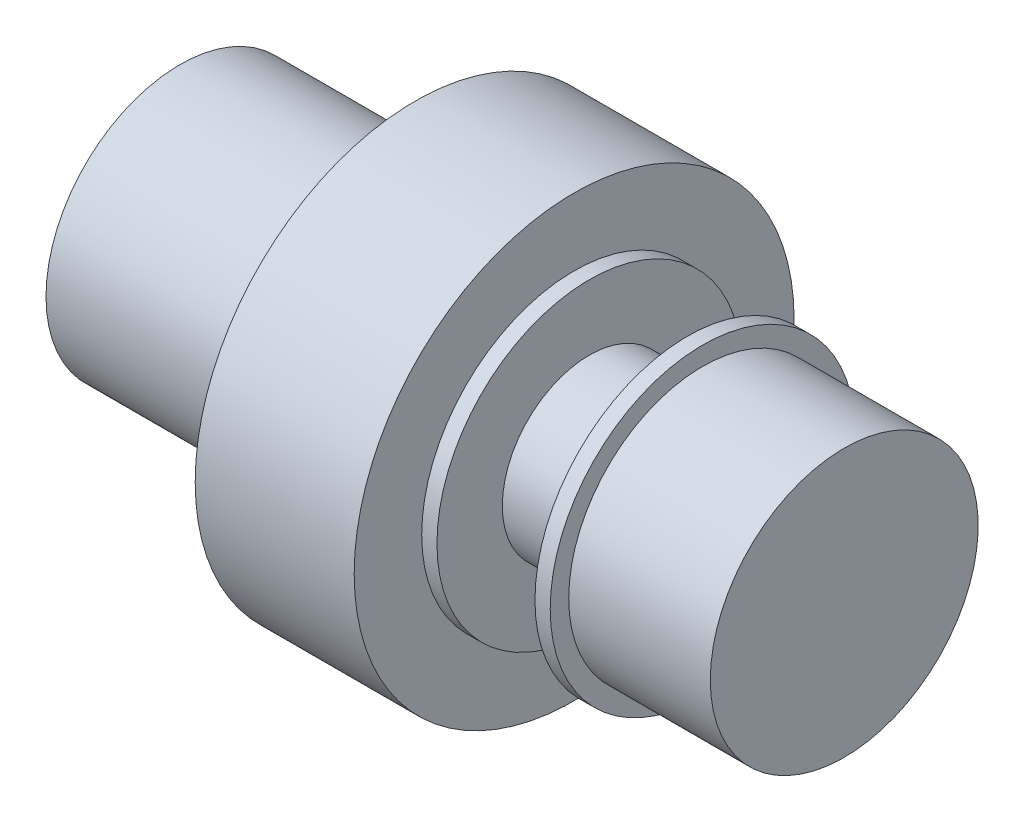
ISO-10303-21;
HEADER;
FILE_DESCRIPTION(('STEP AP214'),'2;1');
FILE_NAME('part.step','',(''),(''),'','','');
FILE_SCHEMA(('AUTOMOTIVE_DESIGN { 1 0 10303 214 1 1 1 1 }'));
ENDSEC;
DATA;
#1=APPLICATION_CONTEXT('core data for automotive mechanical design processes');
#2=APPLICATION_PROTOCOL_DEFINITION('international standard','automotive_design',2000,#1);
#3=PRODUCT_CONTEXT('',#1,'mechanical');
#4=PRODUCT('Part','Part','',(#3));
#5=PRODUCT_RELATED_PRODUCT_CATEGORY('part','',(#4));
#6=PRODUCT_DEFINITION_FORMATION('','',#4);
#7=PRODUCT_DEFINITION_CONTEXT('part definition',#1,'design');
#8=PRODUCT_DEFINITION('design','',#6,#7);
#9=PRODUCT_DEFINITION_SHAPE('','',#8);
#10=(LENGTH_UNIT() NAMED_UNIT(*) SI_UNIT(.MILLI.,.METRE.));
#11=(NAMED_UNIT(*) PLANE_ANGLE_UNIT() SI_UNIT($,.RADIAN.));
#12=(NAMED_UNIT(*) SI_UNIT($,.STERADIAN.) SOLID_ANGLE_UNIT());
#13=UNCERTAINTY_MEASURE_WITH_UNIT(LENGTH_MEASURE(1.E-05),#10,'distance_accuracy_value','');
#14=(GEOMETRIC_REPRESENTATION_CONTEXT(3) GLOBAL_UNCERTAINTY_ASSIGNED_CONTEXT((#13)) GLOBAL_UNIT_ASSIGNED_CONTEXT((#10,
#11,#12)) REPRESENTATION_CONTEXT('',''));
#15=CARTESIAN_POINT('',(0.,0.,0.));
#16=DIRECTION('',(0.,0.,1.));
#17=DIRECTION('',(1.,0.,0.));
#18=AXIS2_PLACEMENT_3D('',#15,#16,#17);
#19=CARTESIAN_POINT('',(28.5,101.,0.));
#20=DIRECTION('',(-1.,0.,0.));
#21=DIRECTION('',(0.,0.,1.));
#22=AXIS2_PLACEMENT_3D('',#19,#20,#21);
#23=PLANE('',#22);
#24=CARTESIAN_POINT('',(28.5,0.,0.));
#25=DIRECTION('',(-1.,0.,0.));
#26=DIRECTION('',(0.,0.,1.));
#27=AXIS2_PLACEMENT_3D('',#24,#25,#26);
#28=CIRCLE('',#27,101.);
#29=CARTESIAN_POINT('',(28.5,0.,101.));
#30=VERTEX_POINT('',#29);
#31=EDGE_CURVE('E11',#30,#30,#28,.T.);
#32=ORIENTED_EDGE('',*,*,#31,.F.);
#33=EDGE_LOOP('',(#32));
#34=FACE_BOUND('',#33,.T.);
#35=CARTESIAN_POINT('',(28.5,0.,0.));
#36=DIRECTION('',(-1.,0.,0.));
#37=DIRECTION('',(0.,0.,1.));
#38=AXIS2_PLACEMENT_3D('',#35,#36,#37);
#39=CIRCLE('',#38,70.);
#40=CARTESIAN_POINT('',(28.5,0.,70.));
#41=VERTEX_POINT('',#40);
#42=EDGE_CURVE('E97',#41,#41,#39,.T.);
#43=ORIENTED_EDGE('',*,*,#42,.T.);
#44=EDGE_LOOP('',(#43));
#45=FACE_BOUND('',#44,.T.);
#46=ADVANCED_FACE('F33',(#34,#45),#23,.F.);
#47=CARTESIAN_POINT('',(-1716.32432220827,0.,0.));
#48=DIRECTION('',(-1.,0.,0.));
#49=DIRECTION('',(0.,0.,1.));
#50=AXIS2_PLACEMENT_3D('',#47,#48,#49);
#51=CYLINDRICAL_SURFACE('',#50,101.);
#52=CARTESIAN_POINT('',(-44.5,0.,0.));
#53=DIRECTION('',(-1.,0.,0.));
#54=DIRECTION('',(0.,0.,1.));
#55=AXIS2_PLACEMENT_3D('',#52,#53,#54);
#56=CIRCLE('',#55,101.);
#57=CARTESIAN_POINT('',(-44.5,0.,101.));
#58=VERTEX_POINT('',#57);
#59=EDGE_CURVE('E40',#58,#58,#56,.T.);
#60=ORIENTED_EDGE('',*,*,#59,.F.);
#61=EDGE_LOOP('',(#60));
#62=FACE_BOUND('',#61,.T.);
#63=ORIENTED_EDGE('',*,*,#31,.T.);
#64=EDGE_LOOP('',(#63));
#65=FACE_BOUND('',#64,.T.);
#66=ADVANCED_FACE('F131',(#62,#65),#51,.T.);
#67=CARTESIAN_POINT('',(-44.5,61.5,0.));
#68=DIRECTION('',(1.,0.,0.));
#69=DIRECTION('',(0.,0.,-1.));
#70=AXIS2_PLACEMENT_3D('',#67,#68,#69);
#71=PLANE('',#70);
#72=CARTESIAN_POINT('',(-44.5,96.,0.));
#73=DIRECTION('',(-1.,0.,0.));
#74=DIRECTION('',(0.,0.,1.));
#75=AXIS2_PLACEMENT_3D('',#72,#73,#74);
#76=CIRCLE('',#75,2.775);
#77=CARTESIAN_POINT('',(-44.5,96.,2.77499999999999));
#78=VERTEX_POINT('',#77);
#79=EDGE_CURVE('E70',#78,#78,#76,.T.);
#80=ORIENTED_EDGE('',*,*,#79,.F.);
#81=EDGE_LOOP('',(#80));
#82=FACE_BOUND('',#81,.T.);
#83=CARTESIAN_POINT('',(-44.5,0.,96.));
#84=DIRECTION('',(-1.,0.,0.));
#85=DIRECTION('',(0.,0.,1.));
#86=AXIS2_PLACEMENT_3D('',#83,#84,#85);
#87=CIRCLE('',#86,2.775);
#88=CARTESIAN_POINT('',(-44.5,0.,98.775));
#89=VERTEX_POINT('',#88);
#90=EDGE_CURVE('E63',#89,#89,#87,.T.);
#91=ORIENTED_EDGE('',*,*,#90,.F.);
#92=EDGE_LOOP('',(#91));
#93=FACE_BOUND('',#92,.T.);
#94=CARTESIAN_POINT('',(-44.5,-96.,0.));
#95=DIRECTION('',(-1.,0.,0.));
#96=DIRECTION('',(0.,0.,1.));
#97=AXIS2_PLACEMENT_3D('',#94,#95,#96);
#98=CIRCLE('',#97,2.775);
#99=CARTESIAN_POINT('',(-44.5,-96.,2.775));
#100=VERTEX_POINT('',#99);
#101=EDGE_CURVE('E79',#100,#100,#98,.T.);
#102=ORIENTED_EDGE('',*,*,#101,.F.);
#103=EDGE_LOOP('',(#102));
#104=FACE_BOUND('',#103,.T.);
#105=CARTESIAN_POINT('',(-44.5,0.,-96.));
#106=DIRECTION('',(-1.,0.,0.));
#107=DIRECTION('',(0.,0.,1.));
#108=AXIS2_PLACEMENT_3D('',#105,#106,#107);
#109=CIRCLE('',#108,2.775);
#110=CARTESIAN_POINT('',(-44.5,0.,-93.225));
#111=VERTEX_POINT('',#110);
#112=EDGE_CURVE('E88',#111,#111,#109,.T.);
#113=ORIENTED_EDGE('',*,*,#112,.F.);
#114=EDGE_LOOP('',(#113));
#115=FACE_BOUND('',#114,.T.);
#116=CARTESIAN_POINT('',(-44.5,0.,0.));
#117=DIRECTION('',(-1.,0.,0.));
#118=DIRECTION('',(0.,0.,1.));
#119=AXIS2_PLACEMENT_3D('',#116,#117,#118);
#120=CIRCLE('',#119,61.5);
#121=CARTESIAN_POINT('',(-44.5,0.,61.5));
#122=VERTEX_POINT('',#121);
#123=EDGE_CURVE('E124',#122,#122,#120,.T.);
#124=ORIENTED_EDGE('',*,*,#123,.F.);
#125=EDGE_LOOP('',(#124));
#126=FACE_BOUND('',#125,.T.);
#127=ORIENTED_EDGE('',*,*,#59,.T.);
#128=EDGE_LOOP('',(#127));
#129=FACE_BOUND('',#128,.T.);
#130=ADVANCED_FACE('F129',(#82,#93,#104,#115,#126,#129),#71,.F.);
#131=CARTESIAN_POINT('',(-1716.32432220827,0.,0.));
#132=DIRECTION('',(-1.,0.,0.));
#133=DIRECTION('',(0.,0.,1.));
#134=AXIS2_PLACEMENT_3D('',#131,#132,#133);
#135=CYLINDRICAL_SURFACE('',#134,61.5);
#136=CARTESIAN_POINT('',(-152.5,0.,0.));
#137=DIRECTION('',(-1.,0.,0.));
#138=DIRECTION('',(0.,0.,1.));
#139=AXIS2_PLACEMENT_3D('',#136,#137,#138);
#140=CIRCLE('',#139,61.5);
#141=CARTESIAN_POINT('',(-152.5,0.,61.5));
#142=VERTEX_POINT('',#141);
#143=EDGE_CURVE('E121',#142,#142,#140,.T.);
#144=ORIENTED_EDGE('',*,*,#143,.F.);
#145=EDGE_LOOP('',(#144));
#146=FACE_BOUND('',#145,.T.);
#147=ORIENTED_EDGE('',*,*,#123,.T.);
#148=EDGE_LOOP('',(#147));
#149=FACE_BOUND('',#148,.T.);
#150=ADVANCED_FACE('F190',(#146,#149),#135,.T.);
#151=CARTESIAN_POINT('',(-152.5,0.,0.));
#152=DIRECTION('',(1.,0.,0.));
#153=DIRECTION('',(0.,0.,-1.));
#154=AXIS2_PLACEMENT_3D('',#151,#152,#153);
#155=PLANE('',#154);
#156=ORIENTED_EDGE('',*,*,#143,.T.);
#157=EDGE_LOOP('',(#156));
#158=FACE_BOUND('',#157,.T.);
#159=ADVANCED_FACE('F185',(#158),#155,.F.);
#160=CARTESIAN_POINT('',(152.5,0.,0.));
#161=DIRECTION('',(-1.,0.,0.));
#162=DIRECTION('',(0.,0.,1.));
#163=AXIS2_PLACEMENT_3D('',#160,#161,#162);
#164=PLANE('',#163);
#165=CARTESIAN_POINT('',(152.5,0.,0.));
#166=DIRECTION('',(-1.,0.,0.));
#167=DIRECTION('',(0.,0.,1.));
#168=AXIS2_PLACEMENT_3D('',#165,#166,#167);
#169=CIRCLE('',#168,61.5);
#170=CARTESIAN_POINT('',(152.5,0.,61.5));
#171=VERTEX_POINT('',#170);
#172=EDGE_CURVE('E118',#171,#171,#169,.T.);
#173=ORIENTED_EDGE('',*,*,#172,.F.);
#174=EDGE_LOOP('',(#173));
#175=FACE_BOUND('',#174,.T.);
#176=ADVANCED_FACE('F180',(#175),#164,.F.);
#177=CARTESIAN_POINT('',(-1716.32432220827,0.,0.));
#178=DIRECTION('',(-1.,0.,0.));
#179=DIRECTION('',(0.,0.,1.));
#180=AXIS2_PLACEMENT_3D('',#177,#178,#179);
#181=CYLINDRICAL_SURFACE('',#180,61.5);
#182=CARTESIAN_POINT('',(87.4999999999999,0.,0.));
#183=DIRECTION('',(-1.,0.,0.));
#184=DIRECTION('',(0.,0.,1.));
#185=AXIS2_PLACEMENT_3D('',#182,#183,#184);
#186=CIRCLE('',#185,61.5);
#187=CARTESIAN_POINT('',(87.4999999999999,0.,61.5));
#188=VERTEX_POINT('',#187);
#189=EDGE_CURVE('E115',#188,#188,#186,.T.);
#190=ORIENTED_EDGE('',*,*,#189,.F.);
#191=EDGE_LOOP('',(#190));
#192=FACE_BOUND('',#191,.T.);
#193=ORIENTED_EDGE('',*,*,#172,.T.);
#194=EDGE_LOOP('',(#193));
#195=FACE_BOUND('',#194,.T.);
#196=ADVANCED_FACE('F174',(#192,#195),#181,.T.);
#197=CARTESIAN_POINT('',(87.5,70.,0.));
#198=DIRECTION('',(-1.,0.,0.));
#199=DIRECTION('',(0.,0.,1.));
#200=AXIS2_PLACEMENT_3D('',#197,#198,#199);
#201=PLANE('',#200);
#202=CARTESIAN_POINT('',(87.4999999999999,0.,0.));
#203=DIRECTION('',(-1.,0.,0.));
#204=DIRECTION('',(0.,0.,1.));
#205=AXIS2_PLACEMENT_3D('',#202,#203,#204);
#206=CIRCLE('',#205,70.);
#207=CARTESIAN_POINT('',(87.4999999999999,0.,70.));
#208=VERTEX_POINT('',#207);
#209=EDGE_CURVE('E112',#208,#208,#206,.T.);
#210=ORIENTED_EDGE('',*,*,#209,.F.);
#211=EDGE_LOOP('',(#210));
#212=FACE_BOUND('',#211,.T.);
#213=ORIENTED_EDGE('',*,*,#189,.T.);
#214=EDGE_LOOP('',(#213));
#215=FACE_BOUND('',#214,.T.);
#216=ADVANCED_FACE('F168',(#212,#215),#201,.F.);
#217=CARTESIAN_POINT('',(-1716.32432220827,0.,0.));
#218=DIRECTION('',(-1.,0.,0.));
#219=DIRECTION('',(0.,0.,1.));
#220=AXIS2_PLACEMENT_3D('',#217,#218,#219);
#221=CYLINDRICAL_SURFACE('',#220,70.);
#222=CARTESIAN_POINT('',(80.5,0.,0.));
#223=DIRECTION('',(-1.,0.,0.));
#224=DIRECTION('',(0.,0.,1.));
#225=AXIS2_PLACEMENT_3D('',#222,#223,#224);
#226=CIRCLE('',#225,70.);
#227=CARTESIAN_POINT('',(80.5,0.,70.));
#228=VERTEX_POINT('',#227);
#229=EDGE_CURVE('E109',#228,#228,#226,.T.);
#230=ORIENTED_EDGE('',*,*,#229,.F.);
#231=EDGE_LOOP('',(#230));
#232=FACE_BOUND('',#231,.T.);
#233=ORIENTED_EDGE('',*,*,#209,.T.);
#234=EDGE_LOOP('',(#233));
#235=FACE_BOUND('',#234,.T.);
#236=ADVANCED_FACE('F162',(#232,#235),#221,.T.);
#237=CARTESIAN_POINT('',(80.5,40.,0.));
#238=DIRECTION('',(1.,0.,0.));
#239=DIRECTION('',(0.,0.,-1.));
#240=AXIS2_PLACEMENT_3D('',#237,#238,#239);
#241=PLANE('',#240);
#242=CARTESIAN_POINT('',(80.5,0.,0.));
#243=DIRECTION('',(-1.,0.,0.));
#244=DIRECTION('',(0.,0.,1.));
#245=AXIS2_PLACEMENT_3D('',#242,#243,#244);
#246=CIRCLE('',#245,40.);
#247=CARTESIAN_POINT('',(80.5,0.,40.));
#248=VERTEX_POINT('',#247);
#249=EDGE_CURVE('E106',#248,#248,#246,.T.);
#250=ORIENTED_EDGE('',*,*,#249,.F.);
#251=EDGE_LOOP('',(#250));
#252=FACE_BOUND('',#251,.T.);
#253=ORIENTED_EDGE('',*,*,#229,.T.);
#254=EDGE_LOOP('',(#253));
#255=FACE_BOUND('',#254,.T.);
#256=ADVANCED_FACE('F156',(#252,#255),#241,.F.);
#257=CARTESIAN_POINT('',(-1716.32432220827,0.,0.));
#258=DIRECTION('',(-1.,0.,0.));
#259=DIRECTION('',(0.,0.,1.));
#260=AXIS2_PLACEMENT_3D('',#257,#258,#259);
#261=CYLINDRICAL_SURFACE('',#260,40.);
#262=CARTESIAN_POINT('',(35.5000000000001,0.,0.));
#263=DIRECTION('',(-1.,0.,0.));
#264=DIRECTION('',(0.,0.,1.));
#265=AXIS2_PLACEMENT_3D('',#262,#263,#264);
#266=CIRCLE('',#265,40.);
#267=CARTESIAN_POINT('',(35.5000000000001,0.,40.));
#268=VERTEX_POINT('',#267);
#269=EDGE_CURVE('E103',#268,#268,#266,.T.);
#270=ORIENTED_EDGE('',*,*,#269,.F.);
#271=EDGE_LOOP('',(#270));
#272=FACE_BOUND('',#271,.T.);
#273=ORIENTED_EDGE('',*,*,#249,.T.);
#274=EDGE_LOOP('',(#273));
#275=FACE_BOUND('',#274,.T.);
#276=ADVANCED_FACE('F150',(#272,#275),#261,.T.);
#277=CARTESIAN_POINT('',(35.5,70.,0.));
#278=DIRECTION('',(-1.,0.,0.));
#279=DIRECTION('',(0.,0.,1.));
#280=AXIS2_PLACEMENT_3D('',#277,#278,#279);
#281=PLANE('',#280);
#282=CARTESIAN_POINT('',(35.5000000000001,0.,0.));
#283=DIRECTION('',(-1.,0.,0.));
#284=DIRECTION('',(0.,0.,1.));
#285=AXIS2_PLACEMENT_3D('',#282,#283,#284);
#286=CIRCLE('',#285,70.);
#287=CARTESIAN_POINT('',(35.5000000000001,0.,70.));
#288=VERTEX_POINT('',#287);
#289=EDGE_CURVE('E100',#288,#288,#286,.T.);
#290=ORIENTED_EDGE('',*,*,#289,.F.);
#291=EDGE_LOOP('',(#290));
#292=FACE_BOUND('',#291,.T.);
#293=ORIENTED_EDGE('',*,*,#269,.T.);
#294=EDGE_LOOP('',(#293));
#295=FACE_BOUND('',#294,.T.);
#296=ADVANCED_FACE('F144',(#292,#295),#281,.F.);
#297=CARTESIAN_POINT('',(-1716.32432220827,0.,0.));
#298=DIRECTION('',(-1.,0.,0.));
#299=DIRECTION('',(0.,0.,1.));
#300=AXIS2_PLACEMENT_3D('',#297,#298,#299);
#301=CYLINDRICAL_SURFACE('',#300,70.);
#302=ORIENTED_EDGE('',*,*,#42,.F.);
#303=EDGE_LOOP('',(#302));
#304=FACE_BOUND('',#303,.T.);
#305=ORIENTED_EDGE('',*,*,#289,.T.);
#306=EDGE_LOOP('',(#305));
#307=FACE_BOUND('',#306,.T.);
#308=ADVANCED_FACE('F140',(#304,#307),#301,.T.);
#309=CARTESIAN_POINT('',(-29.1523667023258,0.,-96.));
#310=DIRECTION('',(-1.,0.,0.));
#311=DIRECTION('',(0.,0.,1.));
#312=AXIS2_PLACEMENT_3D('',#309,#310,#311);
#313=CONICAL_SURFACE('',#312,2.75,1.02974425867665);
#314=CARTESIAN_POINT('',(-27.5,0.,-96.));
#315=VERTEX_POINT('',#314);
#316=VERTEX_LOOP('',#315);
#317=FACE_BOUND('',#316,.T.);
#318=CARTESIAN_POINT('',(-29.1523667023258,0.,-96.));
#319=DIRECTION('',(-1.,0.,0.));
#320=DIRECTION('',(0.,0.,1.));
#321=AXIS2_PLACEMENT_3D('',#318,#319,#320);
#322=CIRCLE('',#321,2.75);
#323=CARTESIAN_POINT('',(-29.1523667023258,0.,-93.25));
#324=VERTEX_POINT('',#323);
#325=EDGE_CURVE('E94',#324,#324,#322,.T.);
#326=ORIENTED_EDGE('',*,*,#325,.T.);
#327=EDGE_LOOP('',(#326));
#328=FACE_BOUND('',#327,.T.);
#329=ADVANCED_FACE('F143',(#317,#328),#313,.F.);
#330=CARTESIAN_POINT('',(-44.5,0.,-96.));
#331=DIRECTION('',(-1.,0.,0.));
#332=DIRECTION('',(0.,0.,1.));
#333=AXIS2_PLACEMENT_3D('',#330,#331,#332);
#334=CYLINDRICAL_SURFACE('',#333,2.74999999999999);
#335=ORIENTED_EDGE('',*,*,#325,.F.);
#336=EDGE_LOOP('',(#335));
#337=FACE_BOUND('',#336,.T.);
#338=CARTESIAN_POINT('',(-44.475,0.,-96.));
#339=DIRECTION('',(-1.,0.,0.));
#340=DIRECTION('',(0.,0.,1.));
#341=AXIS2_PLACEMENT_3D('',#338,#339,#340);
#342=CIRCLE('',#341,2.74999999999998);
#343=CARTESIAN_POINT('',(-44.475,0.,-93.25));
#344=VERTEX_POINT('',#343);
#345=EDGE_CURVE('E91',#344,#344,#342,.T.);
#346=ORIENTED_EDGE('',*,*,#345,.T.);
#347=EDGE_LOOP('',(#346));
#348=FACE_BOUND('',#347,.T.);
#349=ADVANCED_FACE('F216',(#337,#348),#334,.F.);
#350=CARTESIAN_POINT('',(-44.5,0.,-96.));
#351=DIRECTION('',(-1.,0.,0.));
#352=DIRECTION('',(0.,0.,1.));
#353=AXIS2_PLACEMENT_3D('',#350,#351,#352);
#354=CONICAL_SURFACE('',#353,2.775,0.785398163397422);
#355=ORIENTED_EDGE('',*,*,#345,.F.);
#356=EDGE_LOOP('',(#355));
#357=FACE_BOUND('',#356,.T.);
#358=ORIENTED_EDGE('',*,*,#112,.T.);
#359=EDGE_LOOP('',(#358));
#360=FACE_BOUND('',#359,.T.);
#361=ADVANCED_FACE('F213',(#357,#360),#354,.F.);
#362=CARTESIAN_POINT('',(-29.1523667023258,-96.,0.));
#363=DIRECTION('',(-1.,0.,0.));
#364=DIRECTION('',(0.,0.,1.));
#365=AXIS2_PLACEMENT_3D('',#362,#363,#364);
#366=CONICAL_SURFACE('',#365,2.75,1.02974425867665);
#367=CARTESIAN_POINT('',(-27.5,-96.,0.));
#368=VERTEX_POINT('',#367);
#369=VERTEX_LOOP('',#368);
#370=FACE_BOUND('',#369,.T.);
#371=CARTESIAN_POINT('',(-29.1523667023258,-96.,0.));
#372=DIRECTION('',(-1.,0.,0.));
#373=DIRECTION('',(0.,0.,1.));
#374=AXIS2_PLACEMENT_3D('',#371,#372,#373);
#375=CIRCLE('',#374,2.75);
#376=CARTESIAN_POINT('',(-29.1523667023258,-96.,2.75));
#377=VERTEX_POINT('',#376);
#378=EDGE_CURVE('E85',#377,#377,#375,.T.);
#379=ORIENTED_EDGE('',*,*,#378,.T.);
#380=EDGE_LOOP('',(#379));
#381=FACE_BOUND('',#380,.T.);
#382=ADVANCED_FACE('F215',(#370,#381),#366,.F.);
#383=CARTESIAN_POINT('',(-44.5,-96.,0.));
#384=DIRECTION('',(-1.,0.,0.));
#385=DIRECTION('',(0.,0.,1.));
#386=AXIS2_PLACEMENT_3D('',#383,#384,#385);
#387=CYLINDRICAL_SURFACE('',#386,2.74999999999999);
#388=ORIENTED_EDGE('',*,*,#378,.F.);
#389=EDGE_LOOP('',(#388));
#390=FACE_BOUND('',#389,.T.);
#391=CARTESIAN_POINT('',(-44.475,-96.,0.));
#392=DIRECTION('',(-1.,0.,0.));
#393=DIRECTION('',(0.,0.,1.));
#394=AXIS2_PLACEMENT_3D('',#391,#392,#393);
#395=CIRCLE('',#394,2.74999999999997);
#396=CARTESIAN_POINT('',(-44.475,-96.,2.74999999999997));
#397=VERTEX_POINT('',#396);
#398=EDGE_CURVE('E82',#397,#397,#395,.T.);
#399=ORIENTED_EDGE('',*,*,#398,.T.);
#400=EDGE_LOOP('',(#399));
#401=FACE_BOUND('',#400,.T.);
#402=ADVANCED_FACE('F223',(#390,#401),#387,.F.);
#403=CARTESIAN_POINT('',(-44.5,-96.,0.));
#404=DIRECTION('',(-1.,0.,0.));
#405=DIRECTION('',(0.,0.,1.));
#406=AXIS2_PLACEMENT_3D('',#403,#404,#405);
#407=CONICAL_SURFACE('',#406,2.775,0.785398163397448);
#408=ORIENTED_EDGE('',*,*,#398,.F.);
#409=EDGE_LOOP('',(#408));
#410=FACE_BOUND('',#409,.T.);
#411=ORIENTED_EDGE('',*,*,#101,.T.);
#412=EDGE_LOOP('',(#411));
#413=FACE_BOUND('',#412,.T.);
#414=ADVANCED_FACE('F261',(#410,#413),#407,.F.);
#415=CARTESIAN_POINT('',(-29.1523667023258,0.,96.));
#416=DIRECTION('',(-1.,0.,0.));
#417=DIRECTION('',(0.,0.,1.));
#418=AXIS2_PLACEMENT_3D('',#415,#416,#417);
#419=CONICAL_SURFACE('',#418,2.75,1.02974425867665);
#420=CARTESIAN_POINT('',(-27.5,0.,96.));
#421=VERTEX_POINT('',#420);
#422=VERTEX_LOOP('',#421);
#423=FACE_BOUND('',#422,.T.);
#424=CARTESIAN_POINT('',(-29.1523667023258,0.,96.));
#425=DIRECTION('',(-1.,0.,0.));
#426=DIRECTION('',(0.,0.,1.));
#427=AXIS2_PLACEMENT_3D('',#424,#425,#426);
#428=CIRCLE('',#427,2.75);
#429=CARTESIAN_POINT('',(-29.1523667023258,0.,98.75));
#430=VERTEX_POINT('',#429);
#431=EDGE_CURVE('E76',#430,#430,#428,.T.);
#432=ORIENTED_EDGE('',*,*,#431,.T.);
#433=EDGE_LOOP('',(#432));
#434=FACE_BOUND('',#433,.T.);
#435=ADVANCED_FACE('F270',(#423,#434),#419,.F.);
#436=CARTESIAN_POINT('',(-44.5,0.,96.));
#437=DIRECTION('',(-1.,0.,0.));
#438=DIRECTION('',(0.,0.,1.));
#439=AXIS2_PLACEMENT_3D('',#436,#437,#438);
#440=CYLINDRICAL_SURFACE('',#439,2.74999999999999);
#441=ORIENTED_EDGE('',*,*,#431,.F.);
#442=EDGE_LOOP('',(#441));
#443=FACE_BOUND('',#442,.T.);
#444=CARTESIAN_POINT('',(-44.475,0.,96.));
#445=DIRECTION('',(-1.,0.,0.));
#446=DIRECTION('',(0.,0.,1.));
#447=AXIS2_PLACEMENT_3D('',#444,#445,#446);
#448=CIRCLE('',#447,2.74999999999998);
#449=CARTESIAN_POINT('',(-44.475,0.,98.75));
#450=VERTEX_POINT('',#449);
#451=EDGE_CURVE('E67',#450,#450,#448,.T.);
#452=ORIENTED_EDGE('',*,*,#451,.T.);
#453=EDGE_LOOP('',(#452));
#454=FACE_BOUND('',#453,.T.);
#455=ADVANCED_FACE('F280',(#443,#454),#440,.F.);
#456=CARTESIAN_POINT('',(-44.5,0.,96.));
#457=DIRECTION('',(-1.,0.,0.));
#458=DIRECTION('',(0.,0.,1.));
#459=AXIS2_PLACEMENT_3D('',#456,#457,#458);
#460=CONICAL_SURFACE('',#459,2.775,0.785398163397422);
#461=ORIENTED_EDGE('',*,*,#451,.F.);
#462=EDGE_LOOP('',(#461));
#463=FACE_BOUND('',#462,.T.);
#464=ORIENTED_EDGE('',*,*,#90,.T.);
#465=EDGE_LOOP('',(#464));
#466=FACE_BOUND('',#465,.T.);
#467=ADVANCED_FACE('F57',(#463,#466),#460,.F.);
#468=CARTESIAN_POINT('',(-29.1523667023258,96.,0.));
#469=DIRECTION('',(-1.,0.,0.));
#470=DIRECTION('',(0.,0.,1.));
#471=AXIS2_PLACEMENT_3D('',#468,#469,#470);
#472=CONICAL_SURFACE('',#471,2.75,1.02974425867665);
#473=CARTESIAN_POINT('',(-27.5,96.,0.));
#474=VERTEX_POINT('',#473);
#475=VERTEX_LOOP('',#474);
#476=FACE_BOUND('',#475,.T.);
#477=CARTESIAN_POINT('',(-29.1523667023258,96.,0.));
#478=DIRECTION('',(-1.,0.,0.));
#479=DIRECTION('',(0.,0.,1.));
#480=AXIS2_PLACEMENT_3D('',#477,#478,#479);
#481=CIRCLE('',#480,2.75);
#482=CARTESIAN_POINT('',(-29.1523667023258,96.,2.75));
#483=VERTEX_POINT('',#482);
#484=EDGE_CURVE('E61',#483,#483,#481,.T.);
#485=ORIENTED_EDGE('',*,*,#484,.T.);
#486=EDGE_LOOP('',(#485));
#487=FACE_BOUND('',#486,.T.);
#488=ADVANCED_FACE('F53',(#476,#487),#472,.F.);
#489=CARTESIAN_POINT('',(-44.5,96.,0.));
#490=DIRECTION('',(-1.,0.,0.));
#491=DIRECTION('',(0.,0.,1.));
#492=AXIS2_PLACEMENT_3D('',#489,#490,#491);
#493=CYLINDRICAL_SURFACE('',#492,2.74999999999999);
#494=ORIENTED_EDGE('',*,*,#484,.F.);
#495=EDGE_LOOP('',(#494));
#496=FACE_BOUND('',#495,.T.);
#497=CARTESIAN_POINT('',(-44.475,96.,0.));
#498=DIRECTION('',(-1.,0.,0.));
#499=DIRECTION('',(0.,0.,1.));
#500=AXIS2_PLACEMENT_3D('',#497,#498,#499);
#501=CIRCLE('',#500,2.74999999999997);
#502=CARTESIAN_POINT('',(-44.475,96.,2.74999999999997));
#503=VERTEX_POINT('',#502);
#504=EDGE_CURVE('E64',#503,#503,#501,.T.);
#505=ORIENTED_EDGE('',*,*,#504,.T.);
#506=EDGE_LOOP('',(#505));
#507=FACE_BOUND('',#506,.T.);
#508=ADVANCED_FACE('F56',(#496,#507),#493,.F.);
#509=CARTESIAN_POINT('',(-44.5,96.,0.));
#510=DIRECTION('',(-1.,0.,0.));
#511=DIRECTION('',(0.,0.,1.));
#512=AXIS2_PLACEMENT_3D('',#509,#510,#511);
#513=CONICAL_SURFACE('',#512,2.775,0.785398163397448);
#514=ORIENTED_EDGE('',*,*,#504,.F.);
#515=EDGE_LOOP('',(#514));
#516=FACE_BOUND('',#515,.T.);
#517=ORIENTED_EDGE('',*,*,#79,.T.);
#518=EDGE_LOOP('',(#517));
#519=FACE_BOUND('',#518,.T.);
#520=ADVANCED_FACE('F314',(#516,#519),#513,.F.);
#521=CLOSED_SHELL('',(#46,#66,#130,#150,#159,#176,#196,#216,#236,#256,#276,#296,#308,#329,#349,
#361,#382,#402,#414,#435,#455,#467,#488,#508,#520));
#522=MANIFOLD_SOLID_BREP('B2',#521);
#523=ADVANCED_BREP_SHAPE_REPRESENTATION('',(#18,#522),#14);
#524=SHAPE_DEFINITION_REPRESENTATION(#9,#523);
ENDSEC;
END-ISO-10303-21;
